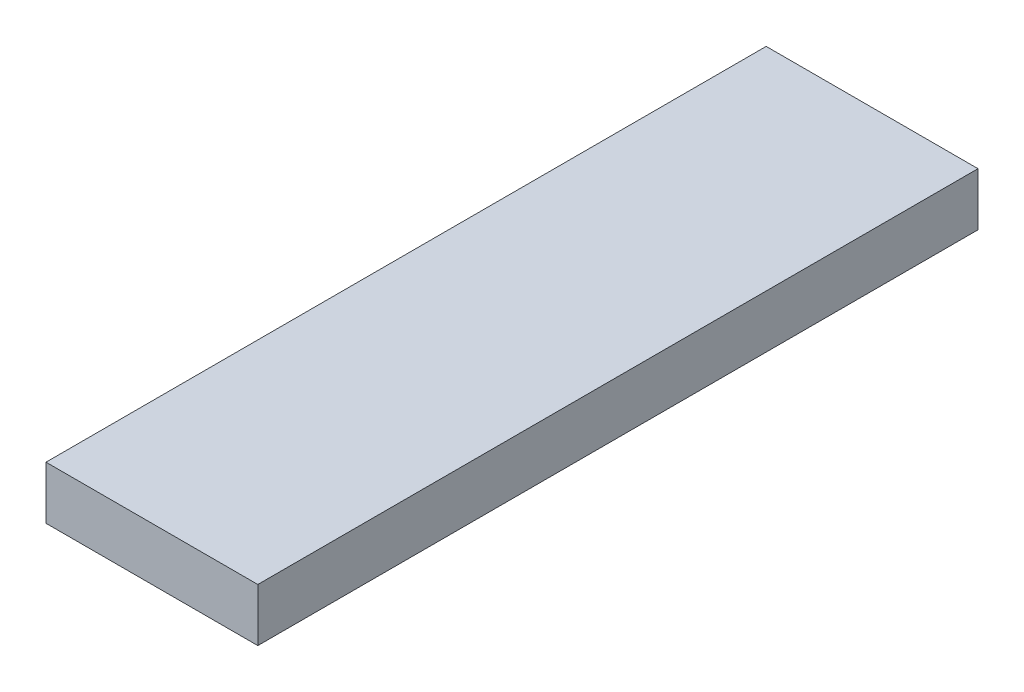
ISO-10303-21;
HEADER;
FILE_DESCRIPTION(('STEP AP214'),'2;1');
FILE_NAME('part.step','',(''),(''),'','','');
FILE_SCHEMA(('AUTOMOTIVE_DESIGN { 1 0 10303 214 1 1 1 1 }'));
ENDSEC;
DATA;
#1=APPLICATION_CONTEXT('core data for automotive mechanical design processes');
#2=APPLICATION_PROTOCOL_DEFINITION('international standard','automotive_design',2000,#1);
#3=PRODUCT_CONTEXT('',#1,'mechanical');
#4=PRODUCT('Part','Part','',(#3));
#5=PRODUCT_RELATED_PRODUCT_CATEGORY('part','',(#4));
#6=PRODUCT_DEFINITION_FORMATION('','',#4);
#7=PRODUCT_DEFINITION_CONTEXT('part definition',#1,'design');
#8=PRODUCT_DEFINITION('design','',#6,#7);
#9=PRODUCT_DEFINITION_SHAPE('','',#8);
#10=(LENGTH_UNIT() NAMED_UNIT(*) SI_UNIT(.MILLI.,.METRE.));
#11=(NAMED_UNIT(*) PLANE_ANGLE_UNIT() SI_UNIT($,.RADIAN.));
#12=(NAMED_UNIT(*) SI_UNIT($,.STERADIAN.) SOLID_ANGLE_UNIT());
#13=UNCERTAINTY_MEASURE_WITH_UNIT(LENGTH_MEASURE(1.E-05),#10,'distance_accuracy_value','');
#14=(GEOMETRIC_REPRESENTATION_CONTEXT(3) GLOBAL_UNCERTAINTY_ASSIGNED_CONTEXT((#13)) GLOBAL_UNIT_ASSIGNED_CONTEXT((#10,
#11,#12)) REPRESENTATION_CONTEXT('',''));
#15=CARTESIAN_POINT('',(0.,0.,0.));
#16=DIRECTION('',(0.,0.,1.));
#17=DIRECTION('',(1.,0.,0.));
#18=AXIS2_PLACEMENT_3D('',#15,#16,#17);
#19=CARTESIAN_POINT('',(6.58406143344709,3.175,24.4269112627986));
#20=DIRECTION('',(-1.,0.,0.));
#21=DIRECTION('',(0.,0.,1.));
#22=AXIS2_PLACEMENT_3D('',#19,#20,#21);
#23=PLANE('',#22);
#24=DIRECTION('',(0.,0.,-1.));
#25=VECTOR('',#24,1.);
#26=CARTESIAN_POINT('',(6.58406143344709,0.,24.4269112627986));
#27=LINE('',#26,#25);
#28=CARTESIAN_POINT('',(6.58406143344709,0.,24.4269112627986));
#29=VERTEX_POINT('',#28);
#30=CARTESIAN_POINT('',(6.58406143344709,0.,-18.7530887372014));
#31=VERTEX_POINT('',#30);
#32=EDGE_CURVE('E113',#29,#31,#27,.T.);
#33=ORIENTED_EDGE('',*,*,#32,.T.);
#34=DIRECTION('',(0.,-1.,0.));
#35=VECTOR('',#34,1.);
#36=CARTESIAN_POINT('',(6.58406143344709,3.175,-18.7530887372014));
#37=LINE('',#36,#35);
#38=CARTESIAN_POINT('',(6.58406143344709,3.175,-18.7530887372014));
#39=VERTEX_POINT('',#38);
#40=EDGE_CURVE('E11',#39,#31,#37,.T.);
#41=ORIENTED_EDGE('',*,*,#40,.F.);
#42=DIRECTION('',(0.,0.,-1.));
#43=VECTOR('',#42,1.);
#44=CARTESIAN_POINT('',(6.58406143344709,3.175,24.4269112627986));
#45=LINE('',#44,#43);
#46=CARTESIAN_POINT('',(6.58406143344709,3.175,24.4269112627986));
#47=VERTEX_POINT('',#46);
#48=EDGE_CURVE('E97',#47,#39,#45,.T.);
#49=ORIENTED_EDGE('',*,*,#48,.F.);
#50=DIRECTION('',(0.,-1.,0.));
#51=VECTOR('',#50,1.);
#52=CARTESIAN_POINT('',(6.58406143344709,3.175,24.4269112627986));
#53=LINE('',#52,#51);
#54=EDGE_CURVE('E109',#47,#29,#53,.T.);
#55=ORIENTED_EDGE('',*,*,#54,.T.);
#56=EDGE_LOOP('',(#33,#41,#49,#55));
#57=FACE_BOUND('',#56,.T.);
#58=ADVANCED_FACE('F45',(#57),#23,.F.);
#59=CARTESIAN_POINT('',(-6.11593856655291,3.175,-18.7530887372014));
#60=DIRECTION('',(0.,0.,1.));
#61=DIRECTION('',(1.,0.,0.));
#62=AXIS2_PLACEMENT_3D('',#59,#60,#61);
#63=PLANE('',#62);
#64=DIRECTION('',(-1.,0.,0.));
#65=VECTOR('',#64,1.);
#66=CARTESIAN_POINT('',(-6.11593856655291,0.,-18.7530887372014));
#67=LINE('',#66,#65);
#68=CARTESIAN_POINT('',(-6.11593856655291,0.,-18.7530887372014));
#69=VERTEX_POINT('',#68);
#70=EDGE_CURVE('E102',#31,#69,#67,.T.);
#71=ORIENTED_EDGE('',*,*,#70,.T.);
#72=DIRECTION('',(0.,-1.,0.));
#73=VECTOR('',#72,1.);
#74=CARTESIAN_POINT('',(-6.11593856655291,3.175,-18.7530887372014));
#75=LINE('',#74,#73);
#76=CARTESIAN_POINT('',(-6.11593856655291,3.175,-18.7530887372014));
#77=VERTEX_POINT('',#76);
#78=EDGE_CURVE('E54',#77,#69,#75,.T.);
#79=ORIENTED_EDGE('',*,*,#78,.F.);
#80=DIRECTION('',(-1.,0.,0.));
#81=VECTOR('',#80,1.);
#82=CARTESIAN_POINT('',(-6.11593856655291,3.175,-18.7530887372014));
#83=LINE('',#82,#81);
#84=EDGE_CURVE('E92',#39,#77,#83,.T.);
#85=ORIENTED_EDGE('',*,*,#84,.F.);
#86=ORIENTED_EDGE('',*,*,#40,.T.);
#87=EDGE_LOOP('',(#71,#79,#85,#86));
#88=FACE_BOUND('',#87,.T.);
#89=ADVANCED_FACE('F101',(#88),#63,.F.);
#90=CARTESIAN_POINT('',(-6.11593856655291,3.175,24.4269112627986));
#91=DIRECTION('',(1.,0.,0.));
#92=DIRECTION('',(0.,0.,-1.));
#93=AXIS2_PLACEMENT_3D('',#90,#91,#92);
#94=PLANE('',#93);
#95=DIRECTION('',(0.,0.,1.));
#96=VECTOR('',#95,1.);
#97=CARTESIAN_POINT('',(-6.11593856655291,0.,24.4269112627986));
#98=LINE('',#97,#96);
#99=CARTESIAN_POINT('',(-6.11593856655291,0.,24.4269112627986));
#100=VERTEX_POINT('',#99);
#101=EDGE_CURVE('E79',#69,#100,#98,.T.);
#102=ORIENTED_EDGE('',*,*,#101,.T.);
#103=DIRECTION('',(0.,-1.,0.));
#104=VECTOR('',#103,1.);
#105=CARTESIAN_POINT('',(-6.11593856655291,3.175,24.4269112627986));
#106=LINE('',#105,#104);
#107=CARTESIAN_POINT('',(-6.11593856655291,3.175,24.4269112627986));
#108=VERTEX_POINT('',#107);
#109=EDGE_CURVE('E104',#108,#100,#106,.T.);
#110=ORIENTED_EDGE('',*,*,#109,.F.);
#111=DIRECTION('',(0.,0.,1.));
#112=VECTOR('',#111,1.);
#113=CARTESIAN_POINT('',(-6.11593856655291,3.175,24.4269112627986));
#114=LINE('',#113,#112);
#115=EDGE_CURVE('E95',#77,#108,#114,.T.);
#116=ORIENTED_EDGE('',*,*,#115,.F.);
#117=ORIENTED_EDGE('',*,*,#78,.T.);
#118=EDGE_LOOP('',(#102,#110,#116,#117));
#119=FACE_BOUND('',#118,.T.);
#120=ADVANCED_FACE('F105',(#119),#94,.F.);
#121=CARTESIAN_POINT('',(-6.11593856655291,3.175,24.4269112627986));
#122=DIRECTION('',(0.,0.,-1.));
#123=DIRECTION('',(-1.,0.,0.));
#124=AXIS2_PLACEMENT_3D('',#121,#122,#123);
#125=PLANE('',#124);
#126=DIRECTION('',(1.,0.,0.));
#127=VECTOR('',#126,1.);
#128=CARTESIAN_POINT('',(-6.11593856655291,0.,24.4269112627986));
#129=LINE('',#128,#127);
#130=EDGE_CURVE('E85',#100,#29,#129,.T.);
#131=ORIENTED_EDGE('',*,*,#130,.T.);
#132=ORIENTED_EDGE('',*,*,#54,.F.);
#133=DIRECTION('',(1.,0.,0.));
#134=VECTOR('',#133,1.);
#135=CARTESIAN_POINT('',(-6.11593856655291,3.175,24.4269112627986));
#136=LINE('',#135,#134);
#137=EDGE_CURVE('E62',#108,#47,#136,.T.);
#138=ORIENTED_EDGE('',*,*,#137,.F.);
#139=ORIENTED_EDGE('',*,*,#109,.T.);
#140=EDGE_LOOP('',(#131,#132,#138,#139));
#141=FACE_BOUND('',#140,.T.);
#142=ADVANCED_FACE('F126',(#141),#125,.F.);
#143=CARTESIAN_POINT('',(0.,3.175,0.));
#144=DIRECTION('',(0.,-1.,0.));
#145=DIRECTION('',(0.,0.,-1.));
#146=AXIS2_PLACEMENT_3D('',#143,#144,#145);
#147=PLANE('',#146);
#148=ORIENTED_EDGE('',*,*,#48,.T.);
#149=ORIENTED_EDGE('',*,*,#84,.T.);
#150=ORIENTED_EDGE('',*,*,#115,.T.);
#151=ORIENTED_EDGE('',*,*,#137,.T.);
#152=EDGE_LOOP('',(#148,#149,#150,#151));
#153=FACE_BOUND('',#152,.T.);
#154=ADVANCED_FACE('F93',(#153),#147,.F.);
#155=CARTESIAN_POINT('',(0.,0.,0.));
#156=DIRECTION('',(0.,-1.,0.));
#157=DIRECTION('',(0.,0.,-1.));
#158=AXIS2_PLACEMENT_3D('',#155,#156,#157);
#159=PLANE('',#158);
#160=ORIENTED_EDGE('',*,*,#32,.F.);
#161=ORIENTED_EDGE('',*,*,#130,.F.);
#162=ORIENTED_EDGE('',*,*,#101,.F.);
#163=ORIENTED_EDGE('',*,*,#70,.F.);
#164=EDGE_LOOP('',(#160,#161,#162,#163));
#165=FACE_BOUND('',#164,.T.);
#166=ADVANCED_FACE('F129',(#165),#159,.T.);
#167=CLOSED_SHELL('',(#58,#89,#120,#142,#154,#166));
#168=MANIFOLD_SOLID_BREP('B2',#167);
#169=ADVANCED_BREP_SHAPE_REPRESENTATION('',(#18,#168),#14);
#170=SHAPE_DEFINITION_REPRESENTATION(#9,#169);
ENDSEC;
END-ISO-10303-21;
